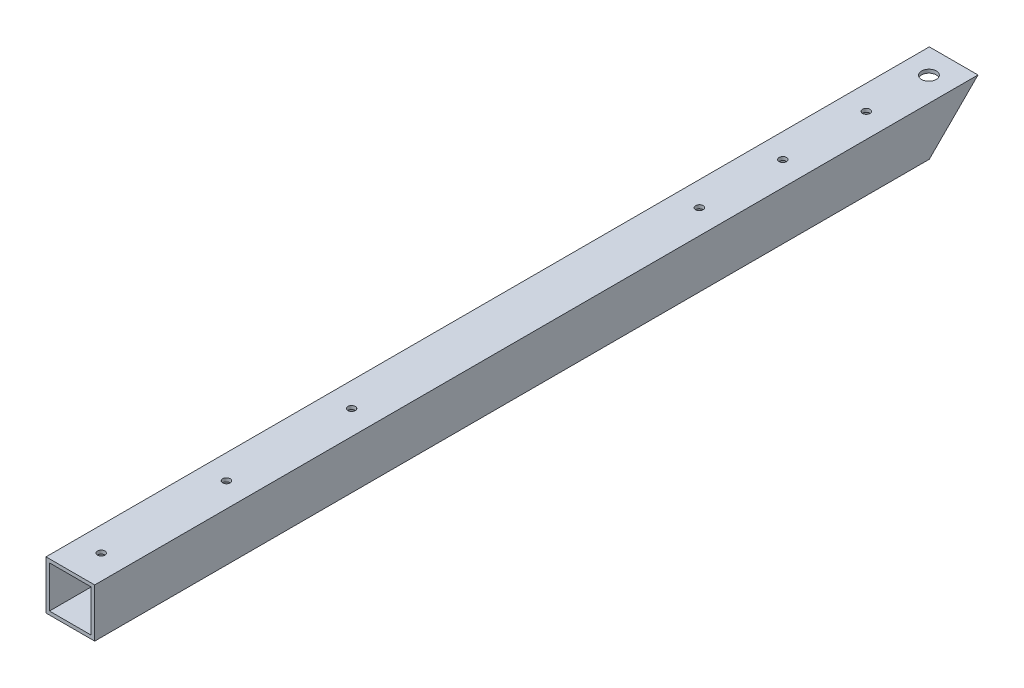
ISO-10303-21;
HEADER;
FILE_DESCRIPTION(('STEP AP214'),'2;1');
FILE_NAME('part.step','',(''),(''),'','','');
FILE_SCHEMA(('AUTOMOTIVE_DESIGN { 1 0 10303 214 1 1 1 1 }'));
ENDSEC;
DATA;
#1=APPLICATION_CONTEXT('core data for automotive mechanical design processes');
#2=APPLICATION_PROTOCOL_DEFINITION('international standard','automotive_design',2000,#1);
#3=PRODUCT_CONTEXT('',#1,'mechanical');
#4=PRODUCT('Part','Part','',(#3));
#5=PRODUCT_RELATED_PRODUCT_CATEGORY('part','',(#4));
#6=PRODUCT_DEFINITION_FORMATION('','',#4);
#7=PRODUCT_DEFINITION_CONTEXT('part definition',#1,'design');
#8=PRODUCT_DEFINITION('design','',#6,#7);
#9=PRODUCT_DEFINITION_SHAPE('','',#8);
#10=(LENGTH_UNIT() NAMED_UNIT(*) SI_UNIT(.MILLI.,.METRE.));
#11=(NAMED_UNIT(*) PLANE_ANGLE_UNIT() SI_UNIT($,.RADIAN.));
#12=(NAMED_UNIT(*) SI_UNIT($,.STERADIAN.) SOLID_ANGLE_UNIT());
#13=UNCERTAINTY_MEASURE_WITH_UNIT(LENGTH_MEASURE(1.E-05),#10,'distance_accuracy_value','');
#14=(GEOMETRIC_REPRESENTATION_CONTEXT(3) GLOBAL_UNCERTAINTY_ASSIGNED_CONTEXT((#13)) GLOBAL_UNIT_ASSIGNED_CONTEXT((#10,
#11,#12)) REPRESENTATION_CONTEXT('',''));
#15=CARTESIAN_POINT('',(0.,0.,0.));
#16=DIRECTION('',(0.,0.,1.));
#17=DIRECTION('',(1.,0.,0.));
#18=AXIS2_PLACEMENT_3D('',#15,#16,#17);
#19=CARTESIAN_POINT('',(22.225,-22.225,1044.575));
#20=DIRECTION('',(-1.,0.,0.));
#21=DIRECTION('',(0.,0.,1.));
#22=AXIS2_PLACEMENT_3D('',#19,#20,#21);
#23=PLANE('',#22);
#24=DIRECTION('',(0.,0.,-1.));
#25=VECTOR('',#24,1.);
#26=CARTESIAN_POINT('',(22.225,-22.225,1044.575));
#27=LINE('',#26,#25);
#28=CARTESIAN_POINT('',(22.225,-22.225,1044.81376));
#29=VERTEX_POINT('',#28);
#30=CARTESIAN_POINT('',(22.225,-22.225,282.81376));
#31=VERTEX_POINT('',#30);
#32=EDGE_CURVE('E263',#29,#31,#27,.T.);
#33=ORIENTED_EDGE('',*,*,#32,.T.);
#34=DIRECTION('',(0.,0.707106781186548,-0.707106781186547));
#35=VECTOR('',#34,1.);
#36=CARTESIAN_POINT('',(22.225,-22.225,282.81376));
#37=LINE('',#36,#35);
#38=CARTESIAN_POINT('',(22.225,22.225,238.36376));
#39=VERTEX_POINT('',#38);
#40=EDGE_CURVE('E51',#31,#39,#37,.T.);
#41=ORIENTED_EDGE('',*,*,#40,.T.);
#42=DIRECTION('',(0.,0.,-1.));
#43=VECTOR('',#42,1.);
#44=CARTESIAN_POINT('',(22.225,22.225,1044.575));
#45=LINE('',#44,#43);
#46=CARTESIAN_POINT('',(22.225,22.225,1044.81376));
#47=VERTEX_POINT('',#46);
#48=EDGE_CURVE('E44',#47,#39,#45,.T.);
#49=ORIENTED_EDGE('',*,*,#48,.F.);
#50=DIRECTION('',(0.,1.,0.));
#51=VECTOR('',#50,1.);
#52=CARTESIAN_POINT('',(22.225,-22.225,1044.81376));
#53=LINE('',#52,#51);
#54=EDGE_CURVE('E139',#29,#47,#53,.T.);
#55=ORIENTED_EDGE('',*,*,#54,.F.);
#56=EDGE_LOOP('',(#33,#41,#49,#55));
#57=FACE_BOUND('',#56,.T.);
#58=ADVANCED_FACE('F36',(#57),#23,.F.);
#59=CARTESIAN_POINT('',(-22.225,22.225,1044.575));
#60=DIRECTION('',(0.,-1.,0.));
#61=DIRECTION('',(1.,0.,0.));
#62=AXIS2_PLACEMENT_3D('',#59,#60,#61);
#63=PLANE('',#62);
#64=CARTESIAN_POINT('',(0.,22.225,260.985));
#65=DIRECTION('',(0.,1.,0.));
#66=DIRECTION('',(0.,0.,1.));
#67=AXIS2_PLACEMENT_3D('',#64,#65,#66);
#68=CIRCLE('',#67,6.74623999999997);
#69=CARTESIAN_POINT('',(0.,22.225,267.73124));
#70=VERTEX_POINT('',#69);
#71=EDGE_CURVE('E172',#70,#70,#68,.T.);
#72=ORIENTED_EDGE('',*,*,#71,.F.);
#73=EDGE_LOOP('',(#72));
#74=FACE_BOUND('',#73,.T.);
#75=CARTESIAN_POINT('',(0.,22.225,318.135));
#76=DIRECTION('',(0.,1.,0.));
#77=DIRECTION('',(0.,0.,1.));
#78=AXIS2_PLACEMENT_3D('',#75,#76,#77);
#79=CIRCLE('',#78,3.37819999999999);
#80=CARTESIAN_POINT('',(0.,22.225,321.5132));
#81=VERTEX_POINT('',#80);
#82=EDGE_CURVE('E177',#81,#81,#79,.T.);
#83=ORIENTED_EDGE('',*,*,#82,.F.);
#84=EDGE_LOOP('',(#83));
#85=FACE_BOUND('',#84,.T.);
#86=CARTESIAN_POINT('',(0.,22.225,394.335));
#87=DIRECTION('',(0.,1.,0.));
#88=DIRECTION('',(0.,0.,1.));
#89=AXIS2_PLACEMENT_3D('',#86,#87,#88);
#90=CIRCLE('',#89,3.37819999999999);
#91=CARTESIAN_POINT('',(0.,22.225,397.7132));
#92=VERTEX_POINT('',#91);
#93=EDGE_CURVE('E190',#92,#92,#90,.T.);
#94=ORIENTED_EDGE('',*,*,#93,.F.);
#95=EDGE_LOOP('',(#94));
#96=FACE_BOUND('',#95,.T.);
#97=CARTESIAN_POINT('',(0.,22.225,470.535));
#98=DIRECTION('',(0.,1.,0.));
#99=DIRECTION('',(0.,0.,1.));
#100=AXIS2_PLACEMENT_3D('',#97,#98,#99);
#101=CIRCLE('',#100,3.37819999999999);
#102=CARTESIAN_POINT('',(0.,22.225,473.9132));
#103=VERTEX_POINT('',#102);
#104=EDGE_CURVE('E203',#103,#103,#101,.T.);
#105=ORIENTED_EDGE('',*,*,#104,.F.);
#106=EDGE_LOOP('',(#105));
#107=FACE_BOUND('',#106,.T.);
#108=CARTESIAN_POINT('',(0.,22.225,788.035));
#109=DIRECTION('',(0.,1.,0.));
#110=DIRECTION('',(0.,0.,1.));
#111=AXIS2_PLACEMENT_3D('',#108,#109,#110);
#112=CIRCLE('',#111,3.37819999999999);
#113=CARTESIAN_POINT('',(0.,22.225,791.4132));
#114=VERTEX_POINT('',#113);
#115=EDGE_CURVE('E216',#114,#114,#112,.T.);
#116=ORIENTED_EDGE('',*,*,#115,.F.);
#117=EDGE_LOOP('',(#116));
#118=FACE_BOUND('',#117,.T.);
#119=CARTESIAN_POINT('',(1.1223889042684E-13,22.225,902.335));
#120=DIRECTION('',(0.,1.,0.));
#121=DIRECTION('',(0.,0.,1.));
#122=AXIS2_PLACEMENT_3D('',#119,#120,#121);
#123=CIRCLE('',#122,3.37819999999999);
#124=CARTESIAN_POINT('',(1.1223889042684E-13,22.225,905.7132));
#125=VERTEX_POINT('',#124);
#126=EDGE_CURVE('E229',#125,#125,#123,.T.);
#127=ORIENTED_EDGE('',*,*,#126,.F.);
#128=EDGE_LOOP('',(#127));
#129=FACE_BOUND('',#128,.T.);
#130=CARTESIAN_POINT('',(1.26236603341094E-13,22.225,1016.635));
#131=DIRECTION('',(0.,1.,0.));
#132=DIRECTION('',(0.,0.,1.));
#133=AXIS2_PLACEMENT_3D('',#130,#131,#132);
#134=CIRCLE('',#133,3.37819999999999);
#135=CARTESIAN_POINT('',(1.26236603341094E-13,22.225,1020.0132));
#136=VERTEX_POINT('',#135);
#137=EDGE_CURVE('E242',#136,#136,#134,.T.);
#138=ORIENTED_EDGE('',*,*,#137,.F.);
#139=EDGE_LOOP('',(#138));
#140=FACE_BOUND('',#139,.T.);
#141=ORIENTED_EDGE('',*,*,#48,.T.);
#142=DIRECTION('',(-1.,0.,0.));
#143=VECTOR('',#142,1.);
#144=CARTESIAN_POINT('',(22.225,22.225,238.36376));
#145=LINE('',#144,#143);
#146=CARTESIAN_POINT('',(-22.225,22.225,238.36376));
#147=VERTEX_POINT('',#146);
#148=EDGE_CURVE('E159',#39,#147,#145,.T.);
#149=ORIENTED_EDGE('',*,*,#148,.T.);
#150=DIRECTION('',(0.,0.,-1.));
#151=VECTOR('',#150,1.);
#152=CARTESIAN_POINT('',(-22.225,22.225,1044.575));
#153=LINE('',#152,#151);
#154=CARTESIAN_POINT('',(-22.225,22.225,1044.81376));
#155=VERTEX_POINT('',#154);
#156=EDGE_CURVE('E271',#155,#147,#153,.T.);
#157=ORIENTED_EDGE('',*,*,#156,.F.);
#158=DIRECTION('',(-1.,0.,0.));
#159=VECTOR('',#158,1.);
#160=CARTESIAN_POINT('',(22.225,22.225,1044.81376));
#161=LINE('',#160,#159);
#162=EDGE_CURVE('E125',#47,#155,#161,.T.);
#163=ORIENTED_EDGE('',*,*,#162,.F.);
#164=EDGE_LOOP('',(#141,#149,#157,#163));
#165=FACE_BOUND('',#164,.T.);
#166=ADVANCED_FACE('F329',(#74,#85,#96,#107,#118,#129,#140,#165),#63,.F.);
#167=CARTESIAN_POINT('',(-22.225,-22.225,1044.575));
#168=DIRECTION('',(1.,0.,0.));
#169=DIRECTION('',(0.,1.,0.));
#170=AXIS2_PLACEMENT_3D('',#167,#168,#169);
#171=PLANE('',#170);
#172=ORIENTED_EDGE('',*,*,#156,.T.);
#173=DIRECTION('',(0.,0.707106781186548,-0.707106781186547));
#174=VECTOR('',#173,1.);
#175=CARTESIAN_POINT('',(-22.225,-22.225,282.81376));
#176=LINE('',#175,#174);
#177=CARTESIAN_POINT('',(-22.225,-22.225,282.81376));
#178=VERTEX_POINT('',#177);
#179=EDGE_CURVE('E124',#178,#147,#176,.T.);
#180=ORIENTED_EDGE('',*,*,#179,.F.);
#181=DIRECTION('',(0.,0.,-1.));
#182=VECTOR('',#181,1.);
#183=CARTESIAN_POINT('',(-22.225,-22.225,1044.575));
#184=LINE('',#183,#182);
#185=CARTESIAN_POINT('',(-22.225,-22.225,1044.81376));
#186=VERTEX_POINT('',#185);
#187=EDGE_CURVE('E267',#186,#178,#184,.T.);
#188=ORIENTED_EDGE('',*,*,#187,.F.);
#189=DIRECTION('',(0.,-1.,0.));
#190=VECTOR('',#189,1.);
#191=CARTESIAN_POINT('',(-22.225,22.225,1044.81376));
#192=LINE('',#191,#190);
#193=EDGE_CURVE('E147',#155,#186,#192,.T.);
#194=ORIENTED_EDGE('',*,*,#193,.F.);
#195=EDGE_LOOP('',(#172,#180,#188,#194));
#196=FACE_BOUND('',#195,.T.);
#197=ADVANCED_FACE('F332',(#196),#171,.F.);
#198=CARTESIAN_POINT('',(-22.225,-22.225,1044.575));
#199=DIRECTION('',(0.,1.,0.));
#200=DIRECTION('',(-1.,0.,0.));
#201=AXIS2_PLACEMENT_3D('',#198,#199,#200);
#202=PLANE('',#201);
#203=CARTESIAN_POINT('',(0.,-22.225,318.135));
#204=DIRECTION('',(0.,1.,0.));
#205=DIRECTION('',(0.,0.,1.));
#206=AXIS2_PLACEMENT_3D('',#203,#204,#205);
#207=CIRCLE('',#206,3.37819999999996);
#208=CARTESIAN_POINT('',(0.,-22.225,321.5132));
#209=VERTEX_POINT('',#208);
#210=EDGE_CURVE('E181',#209,#209,#207,.T.);
#211=ORIENTED_EDGE('',*,*,#210,.T.);
#212=EDGE_LOOP('',(#211));
#213=FACE_BOUND('',#212,.T.);
#214=CARTESIAN_POINT('',(0.,-22.225,394.335));
#215=DIRECTION('',(0.,1.,0.));
#216=DIRECTION('',(0.,0.,1.));
#217=AXIS2_PLACEMENT_3D('',#214,#215,#216);
#218=CIRCLE('',#217,3.37819999999996);
#219=CARTESIAN_POINT('',(0.,-22.225,397.7132));
#220=VERTEX_POINT('',#219);
#221=EDGE_CURVE('E194',#220,#220,#218,.T.);
#222=ORIENTED_EDGE('',*,*,#221,.T.);
#223=EDGE_LOOP('',(#222));
#224=FACE_BOUND('',#223,.T.);
#225=CARTESIAN_POINT('',(0.,-22.225,470.535));
#226=DIRECTION('',(0.,1.,0.));
#227=DIRECTION('',(0.,0.,1.));
#228=AXIS2_PLACEMENT_3D('',#225,#226,#227);
#229=CIRCLE('',#228,3.37819999999996);
#230=CARTESIAN_POINT('',(0.,-22.225,473.9132));
#231=VERTEX_POINT('',#230);
#232=EDGE_CURVE('E207',#231,#231,#229,.T.);
#233=ORIENTED_EDGE('',*,*,#232,.T.);
#234=EDGE_LOOP('',(#233));
#235=FACE_BOUND('',#234,.T.);
#236=CARTESIAN_POINT('',(0.,-22.225,788.035));
#237=DIRECTION('',(0.,1.,0.));
#238=DIRECTION('',(0.,0.,1.));
#239=AXIS2_PLACEMENT_3D('',#236,#237,#238);
#240=CIRCLE('',#239,3.37819999999996);
#241=CARTESIAN_POINT('',(0.,-22.225,791.4132));
#242=VERTEX_POINT('',#241);
#243=EDGE_CURVE('E220',#242,#242,#240,.T.);
#244=ORIENTED_EDGE('',*,*,#243,.T.);
#245=EDGE_LOOP('',(#244));
#246=FACE_BOUND('',#245,.T.);
#247=CARTESIAN_POINT('',(1.1223889042684E-13,-22.225,902.335));
#248=DIRECTION('',(0.,1.,0.));
#249=DIRECTION('',(0.,0.,1.));
#250=AXIS2_PLACEMENT_3D('',#247,#248,#249);
#251=CIRCLE('',#250,3.37819999999996);
#252=CARTESIAN_POINT('',(1.1223889042684E-13,-22.225,905.7132));
#253=VERTEX_POINT('',#252);
#254=EDGE_CURVE('E233',#253,#253,#251,.T.);
#255=ORIENTED_EDGE('',*,*,#254,.T.);
#256=EDGE_LOOP('',(#255));
#257=FACE_BOUND('',#256,.T.);
#258=CARTESIAN_POINT('',(1.26236603341094E-13,-22.225,1016.635));
#259=DIRECTION('',(0.,1.,0.));
#260=DIRECTION('',(0.,0.,1.));
#261=AXIS2_PLACEMENT_3D('',#258,#259,#260);
#262=CIRCLE('',#261,3.37819999999996);
#263=CARTESIAN_POINT('',(1.26236603341094E-13,-22.225,1020.0132));
#264=VERTEX_POINT('',#263);
#265=EDGE_CURVE('E246',#264,#264,#262,.T.);
#266=ORIENTED_EDGE('',*,*,#265,.T.);
#267=EDGE_LOOP('',(#266));
#268=FACE_BOUND('',#267,.T.);
#269=ORIENTED_EDGE('',*,*,#187,.T.);
#270=DIRECTION('',(-1.,0.,0.));
#271=VECTOR('',#270,1.);
#272=CARTESIAN_POINT('',(22.225,-22.225,282.81376));
#273=LINE('',#272,#271);
#274=EDGE_CURVE('E156',#31,#178,#273,.T.);
#275=ORIENTED_EDGE('',*,*,#274,.F.);
#276=ORIENTED_EDGE('',*,*,#32,.F.);
#277=DIRECTION('',(1.,0.,0.));
#278=VECTOR('',#277,1.);
#279=CARTESIAN_POINT('',(-22.225,-22.225,1044.81376));
#280=LINE('',#279,#278);
#281=EDGE_CURVE('E143',#186,#29,#280,.T.);
#282=ORIENTED_EDGE('',*,*,#281,.F.);
#283=EDGE_LOOP('',(#269,#275,#276,#282));
#284=FACE_BOUND('',#283,.T.);
#285=ADVANCED_FACE('F339',(#213,#224,#235,#246,#257,#268,#284),#202,.F.);
#286=CARTESIAN_POINT('',(19.05,-19.05,1044.575));
#287=DIRECTION('',(-1.,0.,0.));
#288=DIRECTION('',(0.,0.,1.));
#289=AXIS2_PLACEMENT_3D('',#286,#287,#288);
#290=PLANE('',#289);
#291=DIRECTION('',(0.,0.707106781186548,-0.707106781186547));
#292=VECTOR('',#291,1.);
#293=CARTESIAN_POINT('',(19.05,-401.51812,662.106879999999));
#294=LINE('',#293,#292);
#295=CARTESIAN_POINT('',(19.05,-19.05,279.63876));
#296=VERTEX_POINT('',#295);
#297=CARTESIAN_POINT('',(19.05,19.05,241.53876));
#298=VERTEX_POINT('',#297);
#299=EDGE_CURVE('E106',#296,#298,#294,.T.);
#300=ORIENTED_EDGE('',*,*,#299,.F.);
#301=DIRECTION('',(0.,0.,-1.));
#302=VECTOR('',#301,1.);
#303=CARTESIAN_POINT('',(19.05,-19.05,1044.575));
#304=LINE('',#303,#302);
#305=CARTESIAN_POINT('',(19.05,-19.05,1044.81376));
#306=VERTEX_POINT('',#305);
#307=EDGE_CURVE('E101',#306,#296,#304,.T.);
#308=ORIENTED_EDGE('',*,*,#307,.F.);
#309=DIRECTION('',(0.,1.,0.));
#310=VECTOR('',#309,1.);
#311=CARTESIAN_POINT('',(19.05,-19.05,1044.81376));
#312=LINE('',#311,#310);
#313=CARTESIAN_POINT('',(19.05,19.05,1044.81376));
#314=VERTEX_POINT('',#313);
#315=EDGE_CURVE('E105',#306,#314,#312,.T.);
#316=ORIENTED_EDGE('',*,*,#315,.T.);
#317=DIRECTION('',(0.,0.,-1.));
#318=VECTOR('',#317,1.);
#319=CARTESIAN_POINT('',(19.05,19.05,1044.575));
#320=LINE('',#319,#318);
#321=EDGE_CURVE('E260',#314,#298,#320,.T.);
#322=ORIENTED_EDGE('',*,*,#321,.T.);
#323=EDGE_LOOP('',(#300,#308,#316,#322));
#324=FACE_BOUND('',#323,.T.);
#325=ADVANCED_FACE('F103',(#324),#290,.T.);
#326=CARTESIAN_POINT('',(-19.05,19.05,1044.575));
#327=DIRECTION('',(0.,-1.,0.));
#328=DIRECTION('',(1.,0.,0.));
#329=AXIS2_PLACEMENT_3D('',#326,#327,#328);
#330=PLANE('',#329);
#331=DIRECTION('',(-1.,0.,0.));
#332=VECTOR('',#331,1.);
#333=CARTESIAN_POINT('',(-19.05,19.05,241.53876));
#334=LINE('',#333,#332);
#335=CARTESIAN_POINT('',(-19.05,19.05,241.53876));
#336=VERTEX_POINT('',#335);
#337=EDGE_CURVE('E167',#298,#336,#334,.T.);
#338=ORIENTED_EDGE('',*,*,#337,.F.);
#339=ORIENTED_EDGE('',*,*,#321,.F.);
#340=DIRECTION('',(-1.,0.,0.));
#341=VECTOR('',#340,1.);
#342=CARTESIAN_POINT('',(19.05,19.05,1044.81376));
#343=LINE('',#342,#341);
#344=CARTESIAN_POINT('',(-19.05,19.05,1044.81376));
#345=VERTEX_POINT('',#344);
#346=EDGE_CURVE('E122',#314,#345,#343,.T.);
#347=ORIENTED_EDGE('',*,*,#346,.T.);
#348=DIRECTION('',(0.,0.,-1.));
#349=VECTOR('',#348,1.);
#350=CARTESIAN_POINT('',(-19.05,19.05,1044.575));
#351=LINE('',#350,#349);
#352=EDGE_CURVE('E256',#345,#336,#351,.T.);
#353=ORIENTED_EDGE('',*,*,#352,.T.);
#354=EDGE_LOOP('',(#338,#339,#347,#353));
#355=FACE_BOUND('',#354,.T.);
#356=CARTESIAN_POINT('',(0.,19.05,260.985));
#357=DIRECTION('',(0.,-1.,0.));
#358=DIRECTION('',(1.,0.,0.));
#359=AXIS2_PLACEMENT_3D('',#356,#357,#358);
#360=CIRCLE('',#359,6.74623999999996);
#361=CARTESIAN_POINT('',(6.74624,19.05,260.985));
#362=VERTEX_POINT('',#361);
#363=EDGE_CURVE('E176',#362,#362,#360,.T.);
#364=ORIENTED_EDGE('',*,*,#363,.F.);
#365=EDGE_LOOP('',(#364));
#366=FACE_BOUND('',#365,.T.);
#367=CARTESIAN_POINT('',(0.,19.05,318.135));
#368=DIRECTION('',(0.,-1.,0.));
#369=DIRECTION('',(1.,0.,0.));
#370=AXIS2_PLACEMENT_3D('',#367,#368,#369);
#371=CIRCLE('',#370,3.37819999999997);
#372=CARTESIAN_POINT('',(3.37820000000001,19.05,318.135));
#373=VERTEX_POINT('',#372);
#374=EDGE_CURVE('E186',#373,#373,#371,.T.);
#375=ORIENTED_EDGE('',*,*,#374,.F.);
#376=EDGE_LOOP('',(#375));
#377=FACE_BOUND('',#376,.T.);
#378=CARTESIAN_POINT('',(0.,19.05,394.335));
#379=DIRECTION('',(0.,-1.,0.));
#380=DIRECTION('',(1.,0.,0.));
#381=AXIS2_PLACEMENT_3D('',#378,#379,#380);
#382=CIRCLE('',#381,3.37819999999997);
#383=CARTESIAN_POINT('',(3.37820000000002,19.05,394.335));
#384=VERTEX_POINT('',#383);
#385=EDGE_CURVE('E199',#384,#384,#382,.T.);
#386=ORIENTED_EDGE('',*,*,#385,.F.);
#387=EDGE_LOOP('',(#386));
#388=FACE_BOUND('',#387,.T.);
#389=CARTESIAN_POINT('',(0.,19.05,470.535));
#390=DIRECTION('',(0.,-1.,0.));
#391=DIRECTION('',(1.,0.,0.));
#392=AXIS2_PLACEMENT_3D('',#389,#390,#391);
#393=CIRCLE('',#392,3.37819999999997);
#394=CARTESIAN_POINT('',(3.37820000000003,19.05,470.535));
#395=VERTEX_POINT('',#394);
#396=EDGE_CURVE('E212',#395,#395,#393,.T.);
#397=ORIENTED_EDGE('',*,*,#396,.F.);
#398=EDGE_LOOP('',(#397));
#399=FACE_BOUND('',#398,.T.);
#400=CARTESIAN_POINT('',(0.,19.05,788.035));
#401=DIRECTION('',(0.,-1.,0.));
#402=DIRECTION('',(1.,0.,0.));
#403=AXIS2_PLACEMENT_3D('',#400,#401,#402);
#404=CIRCLE('',#403,3.37819999999997);
#405=CARTESIAN_POINT('',(3.37820000000007,19.05,788.035));
#406=VERTEX_POINT('',#405);
#407=EDGE_CURVE('E224',#406,#406,#404,.T.);
#408=ORIENTED_EDGE('',*,*,#407,.F.);
#409=EDGE_LOOP('',(#408));
#410=FACE_BOUND('',#409,.T.);
#411=CARTESIAN_POINT('',(1.1223889042684E-13,19.05,902.335));
#412=DIRECTION('',(0.,-1.,0.));
#413=DIRECTION('',(1.,0.,0.));
#414=AXIS2_PLACEMENT_3D('',#411,#412,#413);
#415=CIRCLE('',#414,3.37819999999997);
#416=CARTESIAN_POINT('',(3.37820000000009,19.05,902.335));
#417=VERTEX_POINT('',#416);
#418=EDGE_CURVE('E238',#417,#417,#415,.T.);
#419=ORIENTED_EDGE('',*,*,#418,.F.);
#420=EDGE_LOOP('',(#419));
#421=FACE_BOUND('',#420,.T.);
#422=CARTESIAN_POINT('',(1.26236603341094E-13,19.05,1016.635));
#423=DIRECTION('',(0.,-1.,0.));
#424=DIRECTION('',(1.,0.,0.));
#425=AXIS2_PLACEMENT_3D('',#422,#423,#424);
#426=CIRCLE('',#425,3.37819999999997);
#427=CARTESIAN_POINT('',(3.3782000000001,19.05,1016.635));
#428=VERTEX_POINT('',#427);
#429=EDGE_CURVE('E111',#428,#428,#426,.T.);
#430=ORIENTED_EDGE('',*,*,#429,.F.);
#431=EDGE_LOOP('',(#430));
#432=FACE_BOUND('',#431,.T.);
#433=ADVANCED_FACE('F303',(#355,#366,#377,#388,#399,#410,#421,#432),#330,.T.);
#434=CARTESIAN_POINT('',(-19.05,-19.05,1044.575));
#435=DIRECTION('',(1.,0.,0.));
#436=DIRECTION('',(0.,0.,-1.));
#437=AXIS2_PLACEMENT_3D('',#434,#435,#436);
#438=PLANE('',#437);
#439=DIRECTION('',(0.,-0.707106781186548,0.707106781186547));
#440=VECTOR('',#439,1.);
#441=CARTESIAN_POINT('',(-19.05,-401.51812,662.106879999999));
#442=LINE('',#441,#440);
#443=CARTESIAN_POINT('',(-19.05,-19.05,279.63876));
#444=VERTEX_POINT('',#443);
#445=EDGE_CURVE('E58',#336,#444,#442,.T.);
#446=ORIENTED_EDGE('',*,*,#445,.F.);
#447=ORIENTED_EDGE('',*,*,#352,.F.);
#448=DIRECTION('',(0.,-1.,0.));
#449=VECTOR('',#448,1.);
#450=CARTESIAN_POINT('',(-19.05,19.05,1044.81376));
#451=LINE('',#450,#449);
#452=CARTESIAN_POINT('',(-19.05,-19.05,1044.81376));
#453=VERTEX_POINT('',#452);
#454=EDGE_CURVE('E131',#345,#453,#451,.T.);
#455=ORIENTED_EDGE('',*,*,#454,.T.);
#456=DIRECTION('',(0.,0.,-1.));
#457=VECTOR('',#456,1.);
#458=CARTESIAN_POINT('',(-19.05,-19.05,1044.575));
#459=LINE('',#458,#457);
#460=EDGE_CURVE('E110',#453,#444,#459,.T.);
#461=ORIENTED_EDGE('',*,*,#460,.T.);
#462=EDGE_LOOP('',(#446,#447,#455,#461));
#463=FACE_BOUND('',#462,.T.);
#464=ADVANCED_FACE('F306',(#463),#438,.T.);
#465=CARTESIAN_POINT('',(-19.05,-19.05,1044.575));
#466=DIRECTION('',(0.,1.,0.));
#467=DIRECTION('',(0.,0.,1.));
#468=AXIS2_PLACEMENT_3D('',#465,#466,#467);
#469=PLANE('',#468);
#470=DIRECTION('',(1.,0.,0.));
#471=VECTOR('',#470,1.);
#472=CARTESIAN_POINT('',(-19.0500000000001,-19.05,279.63876));
#473=LINE('',#472,#471);
#474=EDGE_CURVE('E11',#444,#296,#473,.T.);
#475=ORIENTED_EDGE('',*,*,#474,.F.);
#476=ORIENTED_EDGE('',*,*,#460,.F.);
#477=DIRECTION('',(1.,0.,0.));
#478=VECTOR('',#477,1.);
#479=CARTESIAN_POINT('',(-19.05,-19.05,1044.81376));
#480=LINE('',#479,#478);
#481=EDGE_CURVE('E119',#453,#306,#480,.T.);
#482=ORIENTED_EDGE('',*,*,#481,.T.);
#483=ORIENTED_EDGE('',*,*,#307,.T.);
#484=EDGE_LOOP('',(#475,#476,#482,#483));
#485=FACE_BOUND('',#484,.T.);
#486=CARTESIAN_POINT('',(0.,-19.05,318.135));
#487=DIRECTION('',(0.,1.,0.));
#488=DIRECTION('',(0.,0.,1.));
#489=AXIS2_PLACEMENT_3D('',#486,#487,#488);
#490=CIRCLE('',#489,3.37819999999997);
#491=CARTESIAN_POINT('',(0.,-19.05,321.5132));
#492=VERTEX_POINT('',#491);
#493=EDGE_CURVE('E185',#492,#492,#490,.T.);
#494=ORIENTED_EDGE('',*,*,#493,.F.);
#495=EDGE_LOOP('',(#494));
#496=FACE_BOUND('',#495,.T.);
#497=CARTESIAN_POINT('',(0.,-19.05,394.335));
#498=DIRECTION('',(0.,1.,0.));
#499=DIRECTION('',(0.,0.,1.));
#500=AXIS2_PLACEMENT_3D('',#497,#498,#499);
#501=CIRCLE('',#500,3.37819999999997);
#502=CARTESIAN_POINT('',(0.,-19.05,397.7132));
#503=VERTEX_POINT('',#502);
#504=EDGE_CURVE('E198',#503,#503,#501,.T.);
#505=ORIENTED_EDGE('',*,*,#504,.F.);
#506=EDGE_LOOP('',(#505));
#507=FACE_BOUND('',#506,.T.);
#508=CARTESIAN_POINT('',(0.,-19.05,470.535));
#509=DIRECTION('',(0.,1.,0.));
#510=DIRECTION('',(0.,0.,1.));
#511=AXIS2_PLACEMENT_3D('',#508,#509,#510);
#512=CIRCLE('',#511,3.37819999999997);
#513=CARTESIAN_POINT('',(0.,-19.05,473.9132));
#514=VERTEX_POINT('',#513);
#515=EDGE_CURVE('E211',#514,#514,#512,.T.);
#516=ORIENTED_EDGE('',*,*,#515,.F.);
#517=EDGE_LOOP('',(#516));
#518=FACE_BOUND('',#517,.T.);
#519=CARTESIAN_POINT('',(0.,-19.05,788.035));
#520=DIRECTION('',(0.,1.,0.));
#521=DIRECTION('',(0.,0.,1.));
#522=AXIS2_PLACEMENT_3D('',#519,#520,#521);
#523=CIRCLE('',#522,3.37819999999997);
#524=CARTESIAN_POINT('',(0.,-19.05,791.4132));
#525=VERTEX_POINT('',#524);
#526=EDGE_CURVE('E225',#525,#525,#523,.T.);
#527=ORIENTED_EDGE('',*,*,#526,.F.);
#528=EDGE_LOOP('',(#527));
#529=FACE_BOUND('',#528,.T.);
#530=CARTESIAN_POINT('',(1.1223889042684E-13,-19.05,902.335));
#531=DIRECTION('',(0.,1.,0.));
#532=DIRECTION('',(0.,0.,1.));
#533=AXIS2_PLACEMENT_3D('',#530,#531,#532);
#534=CIRCLE('',#533,3.37819999999997);
#535=CARTESIAN_POINT('',(1.1223889042684E-13,-19.05,905.7132));
#536=VERTEX_POINT('',#535);
#537=EDGE_CURVE('E237',#536,#536,#534,.T.);
#538=ORIENTED_EDGE('',*,*,#537,.F.);
#539=EDGE_LOOP('',(#538));
#540=FACE_BOUND('',#539,.T.);
#541=CARTESIAN_POINT('',(1.26236603341094E-13,-19.05,1016.635));
#542=DIRECTION('',(0.,1.,0.));
#543=DIRECTION('',(0.,0.,1.));
#544=AXIS2_PLACEMENT_3D('',#541,#542,#543);
#545=CIRCLE('',#544,3.37819999999997);
#546=CARTESIAN_POINT('',(1.26236603341094E-13,-19.05,1020.0132));
#547=VERTEX_POINT('',#546);
#548=EDGE_CURVE('E250',#547,#547,#545,.T.);
#549=ORIENTED_EDGE('',*,*,#548,.F.);
#550=EDGE_LOOP('',(#549));
#551=FACE_BOUND('',#550,.T.);
#552=ADVANCED_FACE('F127',(#485,#496,#507,#518,#529,#540,#551),#469,.T.);
#553=CARTESIAN_POINT('',(1.26236603341094E-13,22.225,1016.635));
#554=DIRECTION('',(0.,1.,0.));
#555=DIRECTION('',(0.,0.,1.));
#556=AXIS2_PLACEMENT_3D('',#553,#554,#555);
#557=CYLINDRICAL_SURFACE('',#556,3.37819999999997);
#558=ORIENTED_EDGE('',*,*,#548,.T.);
#559=EDGE_LOOP('',(#558));
#560=FACE_BOUND('',#559,.T.);
#561=ORIENTED_EDGE('',*,*,#265,.F.);
#562=EDGE_LOOP('',(#561));
#563=FACE_BOUND('',#562,.T.);
#564=ADVANCED_FACE('F325',(#560,#563),#557,.F.);
#565=ORIENTED_EDGE('',*,*,#429,.T.);
#566=EDGE_LOOP('',(#565));
#567=FACE_BOUND('',#566,.T.);
#568=ORIENTED_EDGE('',*,*,#137,.T.);
#569=EDGE_LOOP('',(#568));
#570=FACE_BOUND('',#569,.T.);
#571=ADVANCED_FACE('F321',(#567,#570),#557,.F.);
#572=CARTESIAN_POINT('',(1.1223889042684E-13,22.225,902.335));
#573=DIRECTION('',(0.,1.,0.));
#574=DIRECTION('',(0.,0.,1.));
#575=AXIS2_PLACEMENT_3D('',#572,#573,#574);
#576=CYLINDRICAL_SURFACE('',#575,3.37819999999997);
#577=ORIENTED_EDGE('',*,*,#537,.T.);
#578=EDGE_LOOP('',(#577));
#579=FACE_BOUND('',#578,.T.);
#580=ORIENTED_EDGE('',*,*,#254,.F.);
#581=EDGE_LOOP('',(#580));
#582=FACE_BOUND('',#581,.T.);
#583=ADVANCED_FACE('F324',(#579,#582),#576,.F.);
#584=ORIENTED_EDGE('',*,*,#418,.T.);
#585=EDGE_LOOP('',(#584));
#586=FACE_BOUND('',#585,.T.);
#587=ORIENTED_EDGE('',*,*,#126,.T.);
#588=EDGE_LOOP('',(#587));
#589=FACE_BOUND('',#588,.T.);
#590=ADVANCED_FACE('F411',(#586,#589),#576,.F.);
#591=CARTESIAN_POINT('',(0.,22.225,788.035));
#592=DIRECTION('',(0.,1.,0.));
#593=DIRECTION('',(0.,0.,1.));
#594=AXIS2_PLACEMENT_3D('',#591,#592,#593);
#595=CYLINDRICAL_SURFACE('',#594,3.37819999999997);
#596=ORIENTED_EDGE('',*,*,#407,.T.);
#597=EDGE_LOOP('',(#596));
#598=FACE_BOUND('',#597,.T.);
#599=ORIENTED_EDGE('',*,*,#115,.T.);
#600=EDGE_LOOP('',(#599));
#601=FACE_BOUND('',#600,.T.);
#602=ADVANCED_FACE('F419',(#598,#601),#595,.F.);
#603=ORIENTED_EDGE('',*,*,#526,.T.);
#604=EDGE_LOOP('',(#603));
#605=FACE_BOUND('',#604,.T.);
#606=ORIENTED_EDGE('',*,*,#243,.F.);
#607=EDGE_LOOP('',(#606));
#608=FACE_BOUND('',#607,.T.);
#609=ADVANCED_FACE('F426',(#605,#608),#595,.F.);
#610=CARTESIAN_POINT('',(0.,22.225,470.535));
#611=DIRECTION('',(0.,1.,0.));
#612=DIRECTION('',(0.,0.,1.));
#613=AXIS2_PLACEMENT_3D('',#610,#611,#612);
#614=CYLINDRICAL_SURFACE('',#613,3.37819999999997);
#615=ORIENTED_EDGE('',*,*,#515,.T.);
#616=EDGE_LOOP('',(#615));
#617=FACE_BOUND('',#616,.T.);
#618=ORIENTED_EDGE('',*,*,#232,.F.);
#619=EDGE_LOOP('',(#618));
#620=FACE_BOUND('',#619,.T.);
#621=ADVANCED_FACE('F434',(#617,#620),#614,.F.);
#622=ORIENTED_EDGE('',*,*,#396,.T.);
#623=EDGE_LOOP('',(#622));
#624=FACE_BOUND('',#623,.T.);
#625=ORIENTED_EDGE('',*,*,#104,.T.);
#626=EDGE_LOOP('',(#625));
#627=FACE_BOUND('',#626,.T.);
#628=ADVANCED_FACE('F441',(#624,#627),#614,.F.);
#629=CARTESIAN_POINT('',(0.,22.225,394.335));
#630=DIRECTION('',(0.,1.,0.));
#631=DIRECTION('',(0.,0.,1.));
#632=AXIS2_PLACEMENT_3D('',#629,#630,#631);
#633=CYLINDRICAL_SURFACE('',#632,3.37819999999997);
#634=ORIENTED_EDGE('',*,*,#504,.T.);
#635=EDGE_LOOP('',(#634));
#636=FACE_BOUND('',#635,.T.);
#637=ORIENTED_EDGE('',*,*,#221,.F.);
#638=EDGE_LOOP('',(#637));
#639=FACE_BOUND('',#638,.T.);
#640=ADVANCED_FACE('F449',(#636,#639),#633,.F.);
#641=ORIENTED_EDGE('',*,*,#385,.T.);
#642=EDGE_LOOP('',(#641));
#643=FACE_BOUND('',#642,.T.);
#644=ORIENTED_EDGE('',*,*,#93,.T.);
#645=EDGE_LOOP('',(#644));
#646=FACE_BOUND('',#645,.T.);
#647=ADVANCED_FACE('F456',(#643,#646),#633,.F.);
#648=CARTESIAN_POINT('',(0.,22.225,318.135));
#649=DIRECTION('',(0.,1.,0.));
#650=DIRECTION('',(0.,0.,1.));
#651=AXIS2_PLACEMENT_3D('',#648,#649,#650);
#652=CYLINDRICAL_SURFACE('',#651,3.37819999999997);
#653=ORIENTED_EDGE('',*,*,#493,.T.);
#654=EDGE_LOOP('',(#653));
#655=FACE_BOUND('',#654,.T.);
#656=ORIENTED_EDGE('',*,*,#210,.F.);
#657=EDGE_LOOP('',(#656));
#658=FACE_BOUND('',#657,.T.);
#659=ADVANCED_FACE('F464',(#655,#658),#652,.F.);
#660=ORIENTED_EDGE('',*,*,#374,.T.);
#661=EDGE_LOOP('',(#660));
#662=FACE_BOUND('',#661,.T.);
#663=ORIENTED_EDGE('',*,*,#82,.T.);
#664=EDGE_LOOP('',(#663));
#665=FACE_BOUND('',#664,.T.);
#666=ADVANCED_FACE('F471',(#662,#665),#652,.F.);
#667=CARTESIAN_POINT('',(0.,22.225,260.985));
#668=DIRECTION('',(0.,1.,0.));
#669=DIRECTION('',(0.,0.,1.));
#670=AXIS2_PLACEMENT_3D('',#667,#668,#669);
#671=CYLINDRICAL_SURFACE('',#670,6.74623999999996);
#672=ORIENTED_EDGE('',*,*,#363,.T.);
#673=EDGE_LOOP('',(#672));
#674=FACE_BOUND('',#673,.T.);
#675=ORIENTED_EDGE('',*,*,#71,.T.);
#676=EDGE_LOOP('',(#675));
#677=FACE_BOUND('',#676,.T.);
#678=ADVANCED_FACE('F300',(#674,#677),#671,.F.);
#679=CARTESIAN_POINT('',(22.225,-22.225,282.81376));
#680=DIRECTION('',(0.,0.707106781186547,0.707106781186548));
#681=DIRECTION('',(0.,-0.707106781186548,0.707106781186547));
#682=AXIS2_PLACEMENT_3D('',#679,#680,#681);
#683=PLANE('',#682);
#684=ORIENTED_EDGE('',*,*,#299,.T.);
#685=ORIENTED_EDGE('',*,*,#337,.T.);
#686=ORIENTED_EDGE('',*,*,#445,.T.);
#687=ORIENTED_EDGE('',*,*,#474,.T.);
#688=EDGE_LOOP('',(#684,#685,#686,#687));
#689=FACE_BOUND('',#688,.T.);
#690=ORIENTED_EDGE('',*,*,#179,.T.);
#691=ORIENTED_EDGE('',*,*,#148,.F.);
#692=ORIENTED_EDGE('',*,*,#40,.F.);
#693=ORIENTED_EDGE('',*,*,#274,.T.);
#694=EDGE_LOOP('',(#690,#691,#692,#693));
#695=FACE_BOUND('',#694,.T.);
#696=ADVANCED_FACE('F341',(#689,#695),#683,.F.);
#697=CARTESIAN_POINT('',(0.,0.,1044.81376));
#698=DIRECTION('',(0.,0.,1.));
#699=DIRECTION('',(1.,0.,0.));
#700=AXIS2_PLACEMENT_3D('',#697,#698,#699);
#701=PLANE('',#700);
#702=ORIENTED_EDGE('',*,*,#346,.F.);
#703=ORIENTED_EDGE('',*,*,#315,.F.);
#704=ORIENTED_EDGE('',*,*,#481,.F.);
#705=ORIENTED_EDGE('',*,*,#454,.F.);
#706=EDGE_LOOP('',(#702,#703,#704,#705));
#707=FACE_BOUND('',#706,.T.);
#708=ORIENTED_EDGE('',*,*,#54,.T.);
#709=ORIENTED_EDGE('',*,*,#162,.T.);
#710=ORIENTED_EDGE('',*,*,#193,.T.);
#711=ORIENTED_EDGE('',*,*,#281,.T.);
#712=EDGE_LOOP('',(#708,#709,#710,#711));
#713=FACE_BOUND('',#712,.T.);
#714=ADVANCED_FACE('F116',(#707,#713),#701,.T.);
#715=CLOSED_SHELL('',(#58,#166,#197,#285,#325,#433,#464,#552,#564,#571,#583,#590,#602,#609,#621,
#628,#640,#647,#659,#666,#678,#696,#714));
#716=MANIFOLD_SOLID_BREP('B2',#715);
#717=ADVANCED_BREP_SHAPE_REPRESENTATION('',(#18,#716),#14);
#718=SHAPE_DEFINITION_REPRESENTATION(#9,#717);
ENDSEC;
END-ISO-10303-21;
